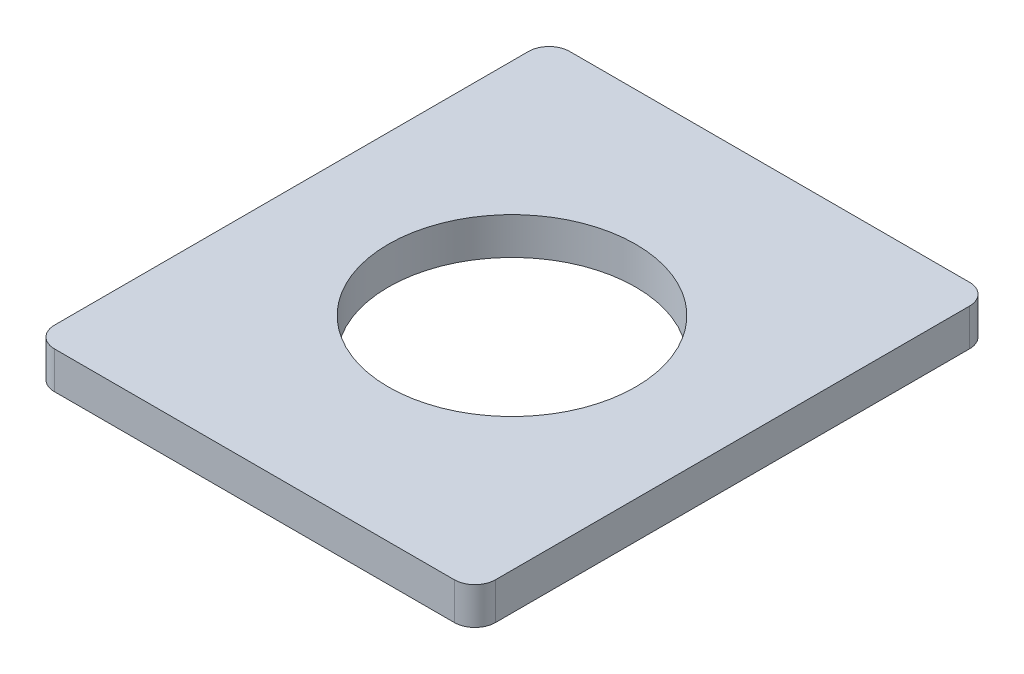
ISO-10303-21;
HEADER;
FILE_DESCRIPTION(('STEP AP214'),'2;1');
FILE_NAME('part.step','',(''),(''),'','','');
FILE_SCHEMA(('AUTOMOTIVE_DESIGN { 1 0 10303 214 1 1 1 1 }'));
ENDSEC;
DATA;
#1=APPLICATION_CONTEXT('core data for automotive mechanical design processes');
#2=APPLICATION_PROTOCOL_DEFINITION('international standard','automotive_design',2000,#1);
#3=PRODUCT_CONTEXT('',#1,'mechanical');
#4=PRODUCT('Part','Part','',(#3));
#5=PRODUCT_RELATED_PRODUCT_CATEGORY('part','',(#4));
#6=PRODUCT_DEFINITION_FORMATION('','',#4);
#7=PRODUCT_DEFINITION_CONTEXT('part definition',#1,'design');
#8=PRODUCT_DEFINITION('design','',#6,#7);
#9=PRODUCT_DEFINITION_SHAPE('','',#8);
#10=(LENGTH_UNIT() NAMED_UNIT(*) SI_UNIT(.MILLI.,.METRE.));
#11=(NAMED_UNIT(*) PLANE_ANGLE_UNIT() SI_UNIT($,.RADIAN.));
#12=(NAMED_UNIT(*) SI_UNIT($,.STERADIAN.) SOLID_ANGLE_UNIT());
#13=UNCERTAINTY_MEASURE_WITH_UNIT(LENGTH_MEASURE(1.E-05),#10,'distance_accuracy_value','');
#14=(GEOMETRIC_REPRESENTATION_CONTEXT(3) GLOBAL_UNCERTAINTY_ASSIGNED_CONTEXT((#13)) GLOBAL_UNIT_ASSIGNED_CONTEXT((#10,
#11,#12)) REPRESENTATION_CONTEXT('',''));
#15=CARTESIAN_POINT('',(0.,0.,0.));
#16=DIRECTION('',(0.,0.,1.));
#17=DIRECTION('',(1.,0.,0.));
#18=AXIS2_PLACEMENT_3D('',#15,#16,#17);
#19=CARTESIAN_POINT('',(0.,18.,0.));
#20=DIRECTION('',(0.,-1.,0.));
#21=DIRECTION('',(0.,0.,-1.));
#22=AXIS2_PLACEMENT_3D('',#19,#20,#21);
#23=PLANE('',#22);
#24=DIRECTION('',(-1.,0.,0.));
#25=VECTOR('',#24,1.);
#26=CARTESIAN_POINT('',(-107.,18.,-125.));
#27=LINE('',#26,#25);
#28=CARTESIAN_POINT('',(97.,18.,-125.));
#29=VERTEX_POINT('',#28);
#30=CARTESIAN_POINT('',(-97.,18.,-125.));
#31=VERTEX_POINT('',#30);
#32=EDGE_CURVE('E142',#29,#31,#27,.T.);
#33=ORIENTED_EDGE('',*,*,#32,.T.);
#34=CARTESIAN_POINT('',(-97.,18.,-115.));
#35=DIRECTION('',(0.,-1.,0.));
#36=DIRECTION('',(0.,0.,-1.));
#37=AXIS2_PLACEMENT_3D('',#34,#35,#36);
#38=CIRCLE('',#37,10.);
#39=CARTESIAN_POINT('',(-107.,18.,-115.));
#40=VERTEX_POINT('',#39);
#41=EDGE_CURVE('E161',#31,#40,#38,.F.);
#42=ORIENTED_EDGE('',*,*,#41,.T.);
#43=DIRECTION('',(0.,0.,1.));
#44=VECTOR('',#43,1.);
#45=CARTESIAN_POINT('',(-107.,18.,125.));
#46=LINE('',#45,#44);
#47=CARTESIAN_POINT('',(-107.,18.,115.));
#48=VERTEX_POINT('',#47);
#49=EDGE_CURVE('E125',#40,#48,#46,.T.);
#50=ORIENTED_EDGE('',*,*,#49,.T.);
#51=CARTESIAN_POINT('',(-97.,18.,115.));
#52=DIRECTION('',(0.,-1.,0.));
#53=DIRECTION('',(0.,0.,-1.));
#54=AXIS2_PLACEMENT_3D('',#51,#52,#53);
#55=CIRCLE('',#54,10.);
#56=CARTESIAN_POINT('',(-97.,18.,125.));
#57=VERTEX_POINT('',#56);
#58=EDGE_CURVE('E156',#48,#57,#55,.F.);
#59=ORIENTED_EDGE('',*,*,#58,.T.);
#60=DIRECTION('',(1.,0.,0.));
#61=VECTOR('',#60,1.);
#62=CARTESIAN_POINT('',(-107.,18.,125.));
#63=LINE('',#62,#61);
#64=CARTESIAN_POINT('',(97.,18.,125.));
#65=VERTEX_POINT('',#64);
#66=EDGE_CURVE('E172',#57,#65,#63,.T.);
#67=ORIENTED_EDGE('',*,*,#66,.T.);
#68=CARTESIAN_POINT('',(97.,18.,115.));
#69=DIRECTION('',(0.,-1.,0.));
#70=DIRECTION('',(0.,0.,-1.));
#71=AXIS2_PLACEMENT_3D('',#68,#69,#70);
#72=CIRCLE('',#71,10.);
#73=CARTESIAN_POINT('',(107.,18.,115.));
#74=VERTEX_POINT('',#73);
#75=EDGE_CURVE('E61',#65,#74,#72,.F.);
#76=ORIENTED_EDGE('',*,*,#75,.T.);
#77=DIRECTION('',(0.,0.,-1.));
#78=VECTOR('',#77,1.);
#79=CARTESIAN_POINT('',(107.,18.,125.));
#80=LINE('',#79,#78);
#81=CARTESIAN_POINT('',(107.,18.,-115.));
#82=VERTEX_POINT('',#81);
#83=EDGE_CURVE('E180',#74,#82,#80,.T.);
#84=ORIENTED_EDGE('',*,*,#83,.T.);
#85=CARTESIAN_POINT('',(97.,18.,-115.));
#86=DIRECTION('',(0.,-1.,0.));
#87=DIRECTION('',(0.,0.,-1.));
#88=AXIS2_PLACEMENT_3D('',#85,#86,#87);
#89=CIRCLE('',#88,10.);
#90=EDGE_CURVE('E159',#82,#29,#89,.F.);
#91=ORIENTED_EDGE('',*,*,#90,.T.);
#92=EDGE_LOOP('',(#33,#42,#50,#59,#67,#76,#84,#91));
#93=FACE_BOUND('',#92,.T.);
#94=CARTESIAN_POINT('',(0.,18.,0.));
#95=DIRECTION('',(0.,1.,0.));
#96=DIRECTION('',(0.,0.,1.));
#97=AXIS2_PLACEMENT_3D('',#94,#95,#96);
#98=CIRCLE('',#97,60.);
#99=CARTESIAN_POINT('',(0.,18.,60.));
#100=VERTEX_POINT('',#99);
#101=EDGE_CURVE('E133',#100,#100,#98,.T.);
#102=ORIENTED_EDGE('',*,*,#101,.F.);
#103=EDGE_LOOP('',(#102));
#104=FACE_BOUND('',#103,.T.);
#105=ADVANCED_FACE('F39',(#93,#104),#23,.F.);
#106=CARTESIAN_POINT('',(0.,0.,0.));
#107=DIRECTION('',(0.,-1.,0.));
#108=DIRECTION('',(0.,0.,-1.));
#109=AXIS2_PLACEMENT_3D('',#106,#107,#108);
#110=PLANE('',#109);
#111=DIRECTION('',(0.,0.,1.));
#112=VECTOR('',#111,1.);
#113=CARTESIAN_POINT('',(-107.,0.,125.));
#114=LINE('',#113,#112);
#115=CARTESIAN_POINT('',(-107.,0.,-115.));
#116=VERTEX_POINT('',#115);
#117=CARTESIAN_POINT('',(-107.,0.,115.));
#118=VERTEX_POINT('',#117);
#119=EDGE_CURVE('E122',#116,#118,#114,.T.);
#120=ORIENTED_EDGE('',*,*,#119,.F.);
#121=CARTESIAN_POINT('',(-97.,0.,-115.));
#122=DIRECTION('',(0.,-1.,0.));
#123=DIRECTION('',(0.,0.,-1.));
#124=AXIS2_PLACEMENT_3D('',#121,#122,#123);
#125=CIRCLE('',#124,10.);
#126=CARTESIAN_POINT('',(-97.,0.,-125.));
#127=VERTEX_POINT('',#126);
#128=EDGE_CURVE('E105',#116,#127,#125,.T.);
#129=ORIENTED_EDGE('',*,*,#128,.T.);
#130=DIRECTION('',(-1.,0.,0.));
#131=VECTOR('',#130,1.);
#132=CARTESIAN_POINT('',(-107.,0.,-125.));
#133=LINE('',#132,#131);
#134=CARTESIAN_POINT('',(97.,0.,-125.));
#135=VERTEX_POINT('',#134);
#136=EDGE_CURVE('E146',#135,#127,#133,.T.);
#137=ORIENTED_EDGE('',*,*,#136,.F.);
#138=CARTESIAN_POINT('',(97.,0.,-115.));
#139=DIRECTION('',(0.,-1.,0.));
#140=DIRECTION('',(0.,0.,-1.));
#141=AXIS2_PLACEMENT_3D('',#138,#139,#140);
#142=CIRCLE('',#141,10.);
#143=CARTESIAN_POINT('',(107.,0.,-115.));
#144=VERTEX_POINT('',#143);
#145=EDGE_CURVE('E116',#135,#144,#142,.T.);
#146=ORIENTED_EDGE('',*,*,#145,.T.);
#147=DIRECTION('',(0.,0.,-1.));
#148=VECTOR('',#147,1.);
#149=CARTESIAN_POINT('',(107.,0.,125.));
#150=LINE('',#149,#148);
#151=CARTESIAN_POINT('',(107.,0.,115.));
#152=VERTEX_POINT('',#151);
#153=EDGE_CURVE('E136',#152,#144,#150,.T.);
#154=ORIENTED_EDGE('',*,*,#153,.F.);
#155=CARTESIAN_POINT('',(97.,0.,115.));
#156=DIRECTION('',(0.,-1.,0.));
#157=DIRECTION('',(0.,0.,-1.));
#158=AXIS2_PLACEMENT_3D('',#155,#156,#157);
#159=CIRCLE('',#158,10.);
#160=CARTESIAN_POINT('',(97.,0.,125.));
#161=VERTEX_POINT('',#160);
#162=EDGE_CURVE('E150',#152,#161,#159,.T.);
#163=ORIENTED_EDGE('',*,*,#162,.T.);
#164=DIRECTION('',(1.,0.,0.));
#165=VECTOR('',#164,1.);
#166=CARTESIAN_POINT('',(-107.,0.,125.));
#167=LINE('',#166,#165);
#168=CARTESIAN_POINT('',(-97.,0.,125.));
#169=VERTEX_POINT('',#168);
#170=EDGE_CURVE('E132',#169,#161,#167,.T.);
#171=ORIENTED_EDGE('',*,*,#170,.F.);
#172=CARTESIAN_POINT('',(-97.,0.,115.));
#173=DIRECTION('',(0.,-1.,0.));
#174=DIRECTION('',(0.,0.,-1.));
#175=AXIS2_PLACEMENT_3D('',#172,#173,#174);
#176=CIRCLE('',#175,10.);
#177=EDGE_CURVE('E126',#169,#118,#176,.T.);
#178=ORIENTED_EDGE('',*,*,#177,.T.);
#179=EDGE_LOOP('',(#120,#129,#137,#146,#154,#163,#171,#178));
#180=FACE_BOUND('',#179,.T.);
#181=CARTESIAN_POINT('',(0.,0.,0.));
#182=DIRECTION('',(0.,1.,0.));
#183=DIRECTION('',(0.,0.,1.));
#184=AXIS2_PLACEMENT_3D('',#181,#182,#183);
#185=CIRCLE('',#184,60.);
#186=CARTESIAN_POINT('',(0.,0.,60.));
#187=VERTEX_POINT('',#186);
#188=EDGE_CURVE('E139',#187,#187,#185,.T.);
#189=ORIENTED_EDGE('',*,*,#188,.T.);
#190=EDGE_LOOP('',(#189));
#191=FACE_BOUND('',#190,.T.);
#192=ADVANCED_FACE('F129',(#180,#191),#110,.T.);
#193=CARTESIAN_POINT('',(-107.,18.,125.));
#194=DIRECTION('',(1.,0.,0.));
#195=DIRECTION('',(0.,0.,-1.));
#196=AXIS2_PLACEMENT_3D('',#193,#194,#195);
#197=PLANE('',#196);
#198=ORIENTED_EDGE('',*,*,#49,.F.);
#199=DIRECTION('',(0.,-1.,0.));
#200=VECTOR('',#199,1.);
#201=CARTESIAN_POINT('',(-107.,18.,-115.));
#202=LINE('',#201,#200);
#203=EDGE_CURVE('E109',#40,#116,#202,.T.);
#204=ORIENTED_EDGE('',*,*,#203,.T.);
#205=ORIENTED_EDGE('',*,*,#119,.T.);
#206=DIRECTION('',(0.,-1.,0.));
#207=VECTOR('',#206,1.);
#208=CARTESIAN_POINT('',(-107.,18.,115.));
#209=LINE('',#208,#207);
#210=EDGE_CURVE('E127',#118,#48,#209,.F.);
#211=ORIENTED_EDGE('',*,*,#210,.T.);
#212=EDGE_LOOP('',(#198,#204,#205,#211));
#213=FACE_BOUND('',#212,.T.);
#214=ADVANCED_FACE('F121',(#213),#197,.F.);
#215=CARTESIAN_POINT('',(-107.,18.,125.));
#216=DIRECTION('',(0.,0.,-1.));
#217=DIRECTION('',(-1.,0.,0.));
#218=AXIS2_PLACEMENT_3D('',#215,#216,#217);
#219=PLANE('',#218);
#220=ORIENTED_EDGE('',*,*,#170,.T.);
#221=DIRECTION('',(0.,-1.,0.));
#222=VECTOR('',#221,1.);
#223=CARTESIAN_POINT('',(97.,18.,125.));
#224=LINE('',#223,#222);
#225=EDGE_CURVE('E11',#161,#65,#224,.F.);
#226=ORIENTED_EDGE('',*,*,#225,.T.);
#227=ORIENTED_EDGE('',*,*,#66,.F.);
#228=DIRECTION('',(0.,-1.,0.));
#229=VECTOR('',#228,1.);
#230=CARTESIAN_POINT('',(-97.,18.,125.));
#231=LINE('',#230,#229);
#232=EDGE_CURVE('E47',#57,#169,#231,.T.);
#233=ORIENTED_EDGE('',*,*,#232,.T.);
#234=EDGE_LOOP('',(#220,#226,#227,#233));
#235=FACE_BOUND('',#234,.T.);
#236=ADVANCED_FACE('F170',(#235),#219,.F.);
#237=CARTESIAN_POINT('',(107.,18.,125.));
#238=DIRECTION('',(-1.,0.,0.));
#239=DIRECTION('',(0.,0.,1.));
#240=AXIS2_PLACEMENT_3D('',#237,#238,#239);
#241=PLANE('',#240);
#242=ORIENTED_EDGE('',*,*,#153,.T.);
#243=DIRECTION('',(0.,-1.,0.));
#244=VECTOR('',#243,1.);
#245=CARTESIAN_POINT('',(107.,18.,-115.));
#246=LINE('',#245,#244);
#247=EDGE_CURVE('E54',#144,#82,#246,.F.);
#248=ORIENTED_EDGE('',*,*,#247,.T.);
#249=ORIENTED_EDGE('',*,*,#83,.F.);
#250=DIRECTION('',(0.,-1.,0.));
#251=VECTOR('',#250,1.);
#252=CARTESIAN_POINT('',(107.,18.,115.));
#253=LINE('',#252,#251);
#254=EDGE_CURVE('E163',#74,#152,#253,.T.);
#255=ORIENTED_EDGE('',*,*,#254,.T.);
#256=EDGE_LOOP('',(#242,#248,#249,#255));
#257=FACE_BOUND('',#256,.T.);
#258=ADVANCED_FACE('F179',(#257),#241,.F.);
#259=CARTESIAN_POINT('',(-107.,18.,-125.));
#260=DIRECTION('',(0.,0.,1.));
#261=DIRECTION('',(1.,0.,0.));
#262=AXIS2_PLACEMENT_3D('',#259,#260,#261);
#263=PLANE('',#262);
#264=ORIENTED_EDGE('',*,*,#136,.T.);
#265=DIRECTION('',(0.,-1.,0.));
#266=VECTOR('',#265,1.);
#267=CARTESIAN_POINT('',(-97.,18.,-125.));
#268=LINE('',#267,#266);
#269=EDGE_CURVE('E110',#127,#31,#268,.F.);
#270=ORIENTED_EDGE('',*,*,#269,.T.);
#271=ORIENTED_EDGE('',*,*,#32,.F.);
#272=DIRECTION('',(0.,-1.,0.));
#273=VECTOR('',#272,1.);
#274=CARTESIAN_POINT('',(97.,18.,-125.));
#275=LINE('',#274,#273);
#276=EDGE_CURVE('E115',#29,#135,#275,.T.);
#277=ORIENTED_EDGE('',*,*,#276,.T.);
#278=EDGE_LOOP('',(#264,#270,#271,#277));
#279=FACE_BOUND('',#278,.T.);
#280=ADVANCED_FACE('F191',(#279),#263,.F.);
#281=CARTESIAN_POINT('',(0.,18.,0.));
#282=DIRECTION('',(0.,-1.,0.));
#283=DIRECTION('',(0.,0.,-1.));
#284=AXIS2_PLACEMENT_3D('',#281,#282,#283);
#285=CYLINDRICAL_SURFACE('',#284,60.);
#286=ORIENTED_EDGE('',*,*,#101,.T.);
#287=EDGE_LOOP('',(#286));
#288=FACE_BOUND('',#287,.T.);
#289=ORIENTED_EDGE('',*,*,#188,.F.);
#290=EDGE_LOOP('',(#289));
#291=FACE_BOUND('',#290,.T.);
#292=ADVANCED_FACE('F189',(#288,#291),#285,.F.);
#293=CARTESIAN_POINT('',(-97.,18.,-115.));
#294=DIRECTION('',(0.,-1.,0.));
#295=DIRECTION('',(0.,0.,-1.));
#296=AXIS2_PLACEMENT_3D('',#293,#294,#295);
#297=CYLINDRICAL_SURFACE('',#296,10.);
#298=ORIENTED_EDGE('',*,*,#41,.F.);
#299=ORIENTED_EDGE('',*,*,#269,.F.);
#300=ORIENTED_EDGE('',*,*,#128,.F.);
#301=ORIENTED_EDGE('',*,*,#203,.F.);
#302=EDGE_LOOP('',(#298,#299,#300,#301));
#303=FACE_BOUND('',#302,.T.);
#304=ADVANCED_FACE('F108',(#303),#297,.T.);
#305=CARTESIAN_POINT('',(97.,18.,-115.));
#306=DIRECTION('',(0.,-1.,0.));
#307=DIRECTION('',(0.,0.,-1.));
#308=AXIS2_PLACEMENT_3D('',#305,#306,#307);
#309=CYLINDRICAL_SURFACE('',#308,10.);
#310=ORIENTED_EDGE('',*,*,#90,.F.);
#311=ORIENTED_EDGE('',*,*,#247,.F.);
#312=ORIENTED_EDGE('',*,*,#145,.F.);
#313=ORIENTED_EDGE('',*,*,#276,.F.);
#314=EDGE_LOOP('',(#310,#311,#312,#313));
#315=FACE_BOUND('',#314,.T.);
#316=ADVANCED_FACE('F198',(#315),#309,.T.);
#317=CARTESIAN_POINT('',(97.,18.,115.));
#318=DIRECTION('',(0.,-1.,0.));
#319=DIRECTION('',(0.,0.,-1.));
#320=AXIS2_PLACEMENT_3D('',#317,#318,#319);
#321=CYLINDRICAL_SURFACE('',#320,10.);
#322=ORIENTED_EDGE('',*,*,#75,.F.);
#323=ORIENTED_EDGE('',*,*,#225,.F.);
#324=ORIENTED_EDGE('',*,*,#162,.F.);
#325=ORIENTED_EDGE('',*,*,#254,.F.);
#326=EDGE_LOOP('',(#322,#323,#324,#325));
#327=FACE_BOUND('',#326,.T.);
#328=ADVANCED_FACE('F178',(#327),#321,.T.);
#329=CARTESIAN_POINT('',(-97.,18.,115.));
#330=DIRECTION('',(0.,-1.,0.));
#331=DIRECTION('',(0.,0.,-1.));
#332=AXIS2_PLACEMENT_3D('',#329,#330,#331);
#333=CYLINDRICAL_SURFACE('',#332,10.);
#334=ORIENTED_EDGE('',*,*,#58,.F.);
#335=ORIENTED_EDGE('',*,*,#210,.F.);
#336=ORIENTED_EDGE('',*,*,#177,.F.);
#337=ORIENTED_EDGE('',*,*,#232,.F.);
#338=EDGE_LOOP('',(#334,#335,#336,#337));
#339=FACE_BOUND('',#338,.T.);
#340=ADVANCED_FACE('F41',(#339),#333,.T.);
#341=CLOSED_SHELL('',(#105,#192,#214,#236,#258,#280,#292,#304,#316,#328,#340));
#342=MANIFOLD_SOLID_BREP('B2',#341);
#343=ADVANCED_BREP_SHAPE_REPRESENTATION('',(#18,#342),#14);
#344=SHAPE_DEFINITION_REPRESENTATION(#9,#343);
ENDSEC;
END-ISO-10303-21;
